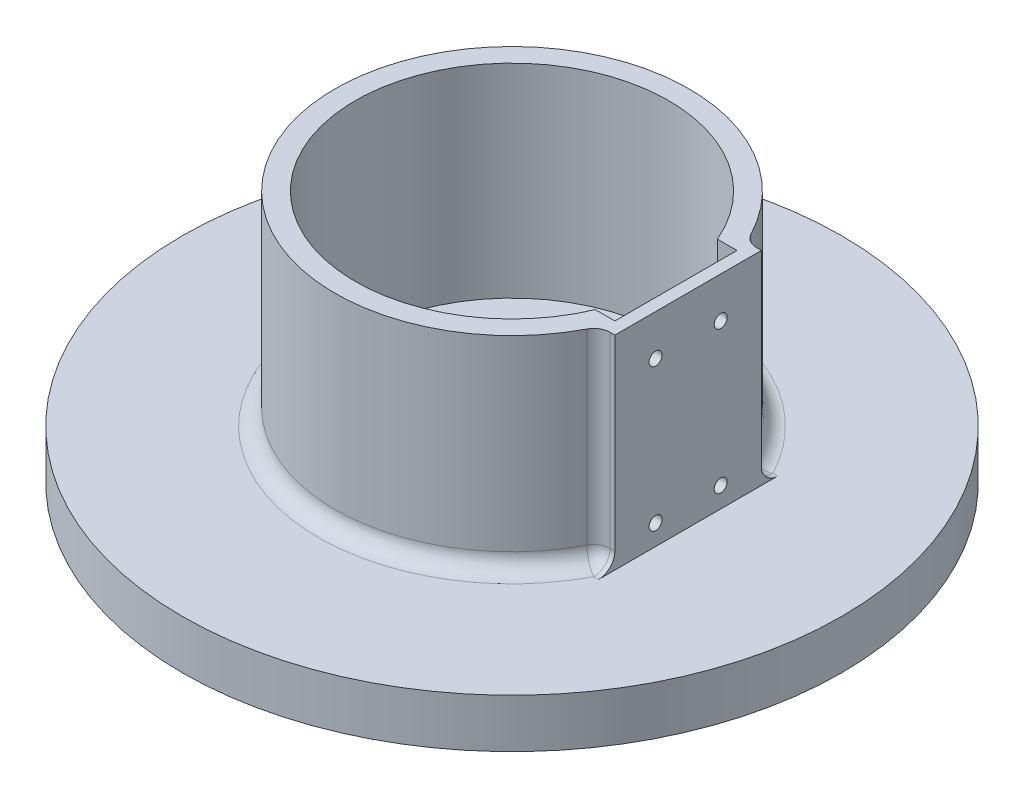
ISO-10303-21;
HEADER;
FILE_DESCRIPTION(('STEP AP214'),'2;1');
FILE_NAME('part.step','',(''),(''),'','','');
FILE_SCHEMA(('AUTOMOTIVE_DESIGN { 1 0 10303 214 1 1 1 1 }'));
ENDSEC;
DATA;
#1=APPLICATION_CONTEXT('core data for automotive mechanical design processes');
#2=APPLICATION_PROTOCOL_DEFINITION('international standard','automotive_design',2000,#1);
#3=PRODUCT_CONTEXT('',#1,'mechanical');
#4=PRODUCT('Part','Part','',(#3));
#5=PRODUCT_RELATED_PRODUCT_CATEGORY('part','',(#4));
#6=PRODUCT_DEFINITION_FORMATION('','',#4);
#7=PRODUCT_DEFINITION_CONTEXT('part definition',#1,'design');
#8=PRODUCT_DEFINITION('design','',#6,#7);
#9=PRODUCT_DEFINITION_SHAPE('','',#8);
#10=(LENGTH_UNIT() NAMED_UNIT(*) SI_UNIT(.MILLI.,.METRE.));
#11=(NAMED_UNIT(*) PLANE_ANGLE_UNIT() SI_UNIT($,.RADIAN.));
#12=(NAMED_UNIT(*) SI_UNIT($,.STERADIAN.) SOLID_ANGLE_UNIT());
#13=UNCERTAINTY_MEASURE_WITH_UNIT(LENGTH_MEASURE(1.E-05),#10,'distance_accuracy_value','');
#14=(GEOMETRIC_REPRESENTATION_CONTEXT(3) GLOBAL_UNCERTAINTY_ASSIGNED_CONTEXT((#13)) GLOBAL_UNIT_ASSIGNED_CONTEXT((#10,
#11,#12)) REPRESENTATION_CONTEXT('',''));
#15=CARTESIAN_POINT('',(0.,0.,0.));
#16=DIRECTION('',(0.,0.,1.));
#17=DIRECTION('',(1.,0.,0.));
#18=AXIS2_PLACEMENT_3D('',#15,#16,#17);
#19=CARTESIAN_POINT('',(105.5,12.,-60.5));
#20=DIRECTION('',(0.,1.,0.));
#21=DIRECTION('',(0.,0.,1.));
#22=AXIS2_PLACEMENT_3D('',#19,#20,#21);
#23=PLANE('',#22);
#24=CARTESIAN_POINT('',(105.5,12.,-60.5));
#25=DIRECTION('',(0.,1.,0.));
#26=DIRECTION('',(0.,0.,1.));
#27=AXIS2_PLACEMENT_3D('',#24,#25,#26);
#28=CIRCLE('',#27,81.);
#29=CARTESIAN_POINT('',(105.5,12.,20.5));
#30=VERTEX_POINT('',#29);
#31=EDGE_CURVE('E224',#30,#30,#28,.T.);
#32=ORIENTED_EDGE('',*,*,#31,.T.);
#33=EDGE_LOOP('',(#32));
#34=FACE_BOUND('',#33,.T.);
#35=DIRECTION('',(1.,0.,0.));
#36=VECTOR('',#35,1.);
#37=CARTESIAN_POINT('',(148.77536626395,12.,-82.5));
#38=LINE('',#37,#36);
#39=CARTESIAN_POINT('',(147.598099719584,12.,-82.5));
#40=VERTEX_POINT('',#39);
#41=CARTESIAN_POINT('',(148.77536626395,12.,-82.5));
#42=VERTEX_POINT('',#41);
#43=EDGE_CURVE('E240',#40,#42,#38,.T.);
#44=ORIENTED_EDGE('',*,*,#43,.T.);
#45=DIRECTION('',(0.,0.,1.));
#46=VECTOR('',#45,1.);
#47=CARTESIAN_POINT('',(148.77536626395,12.,0.));
#48=LINE('',#47,#46);
#49=CARTESIAN_POINT('',(148.77536626395,12.,-38.5));
#50=VERTEX_POINT('',#49);
#51=EDGE_CURVE('E181',#42,#50,#48,.T.);
#52=ORIENTED_EDGE('',*,*,#51,.T.);
#53=DIRECTION('',(1.,0.,0.));
#54=VECTOR('',#53,1.);
#55=CARTESIAN_POINT('',(105.5,12.,-38.5));
#56=LINE('',#55,#54);
#57=CARTESIAN_POINT('',(147.598099719584,12.,-38.5));
#58=VERTEX_POINT('',#57);
#59=EDGE_CURVE('E237',#50,#58,#56,.F.);
#60=ORIENTED_EDGE('',*,*,#59,.T.);
#61=CARTESIAN_POINT('',(105.5,12.,-60.5));
#62=DIRECTION('',(0.,1.,0.));
#63=DIRECTION('',(0.,0.,1.));
#64=AXIS2_PLACEMENT_3D('',#61,#62,#63);
#65=CIRCLE('',#64,47.5);
#66=EDGE_CURVE('E228',#58,#40,#65,.F.);
#67=ORIENTED_EDGE('',*,*,#66,.T.);
#68=EDGE_LOOP('',(#44,#52,#60,#67));
#69=FACE_BOUND('',#68,.T.);
#70=ADVANCED_FACE('F44',(#34,#69),#23,.T.);
#71=CARTESIAN_POINT('',(105.5,12.,-60.5));
#72=DIRECTION('',(0.,1.,0.));
#73=DIRECTION('',(0.,0.,1.));
#74=AXIS2_PLACEMENT_3D('',#71,#72,#73);
#75=CIRCLE('',#74,32.);
#76=CARTESIAN_POINT('',(105.5,12.,-28.5));
#77=VERTEX_POINT('',#76);
#78=EDGE_CURVE('E212',#77,#77,#75,.T.);
#79=ORIENTED_EDGE('',*,*,#78,.F.);
#80=EDGE_LOOP('',(#79));
#81=FACE_BOUND('',#80,.T.);
#82=DIRECTION('',(1.,0.,0.));
#83=VECTOR('',#82,1.);
#84=CARTESIAN_POINT('',(0.,12.,-45.5));
#85=LINE('',#84,#83);
#86=CARTESIAN_POINT('',(140.957721302983,12.,-45.5));
#87=VERTEX_POINT('',#86);
#88=CARTESIAN_POINT('',(145.77536626395,12.,-45.5));
#89=VERTEX_POINT('',#88);
#90=EDGE_CURVE('E189',#87,#89,#85,.T.);
#91=ORIENTED_EDGE('',*,*,#90,.T.);
#92=DIRECTION('',(0.,0.,1.));
#93=VECTOR('',#92,1.);
#94=CARTESIAN_POINT('',(145.77536626395,12.,0.));
#95=LINE('',#94,#93);
#96=CARTESIAN_POINT('',(145.77536626395,12.,-75.5));
#97=VERTEX_POINT('',#96);
#98=EDGE_CURVE('E184',#97,#89,#95,.T.);
#99=ORIENTED_EDGE('',*,*,#98,.F.);
#100=DIRECTION('',(1.,0.,0.));
#101=VECTOR('',#100,1.);
#102=CARTESIAN_POINT('',(0.,12.,-75.5));
#103=LINE('',#102,#101);
#104=CARTESIAN_POINT('',(140.957721302983,12.,-75.5));
#105=VERTEX_POINT('',#104);
#106=EDGE_CURVE('E141',#105,#97,#103,.T.);
#107=ORIENTED_EDGE('',*,*,#106,.F.);
#108=CARTESIAN_POINT('',(105.5,12.,-60.5));
#109=DIRECTION('',(0.,1.,0.));
#110=DIRECTION('',(0.,0.,1.));
#111=AXIS2_PLACEMENT_3D('',#108,#109,#110);
#112=CIRCLE('',#111,38.5);
#113=EDGE_CURVE('E193',#105,#87,#112,.T.);
#114=ORIENTED_EDGE('',*,*,#113,.T.);
#115=EDGE_LOOP('',(#91,#99,#107,#114));
#116=FACE_BOUND('',#115,.T.);
#117=ADVANCED_FACE('F316',(#81,#116),#23,.T.);
#118=CARTESIAN_POINT('',(105.5,12.,-60.5));
#119=DIRECTION('',(0.,-1.,0.));
#120=DIRECTION('',(0.,0.,-1.));
#121=AXIS2_PLACEMENT_3D('',#118,#119,#120);
#122=CYLINDRICAL_SURFACE('',#121,81.);
#123=ORIENTED_EDGE('',*,*,#31,.F.);
#124=EDGE_LOOP('',(#123));
#125=FACE_BOUND('',#124,.T.);
#126=CARTESIAN_POINT('',(105.5,0.,-60.5));
#127=DIRECTION('',(0.,1.,0.));
#128=DIRECTION('',(0.,0.,1.));
#129=AXIS2_PLACEMENT_3D('',#126,#127,#128);
#130=CIRCLE('',#129,81.);
#131=CARTESIAN_POINT('',(105.5,0.,20.5));
#132=VERTEX_POINT('',#131);
#133=EDGE_CURVE('E223',#132,#132,#130,.T.);
#134=ORIENTED_EDGE('',*,*,#133,.T.);
#135=EDGE_LOOP('',(#134));
#136=FACE_BOUND('',#135,.T.);
#137=ADVANCED_FACE('F322',(#125,#136),#122,.T.);
#138=CARTESIAN_POINT('',(105.5,0.,-60.5));
#139=DIRECTION('',(0.,1.,0.));
#140=DIRECTION('',(0.,0.,1.));
#141=AXIS2_PLACEMENT_3D('',#138,#139,#140);
#142=PLANE('',#141);
#143=CARTESIAN_POINT('',(105.5,0.,-60.5));
#144=DIRECTION('',(0.,-1.,0.));
#145=DIRECTION('',(0.,0.,-1.));
#146=AXIS2_PLACEMENT_3D('',#143,#144,#145);
#147=CIRCLE('',#146,76.);
#148=CARTESIAN_POINT('',(105.5,0.,-136.5));
#149=VERTEX_POINT('',#148);
#150=EDGE_CURVE('E219',#149,#149,#147,.T.);
#151=ORIENTED_EDGE('',*,*,#150,.F.);
#152=EDGE_LOOP('',(#151));
#153=FACE_BOUND('',#152,.T.);
#154=ORIENTED_EDGE('',*,*,#133,.F.);
#155=EDGE_LOOP('',(#154));
#156=FACE_BOUND('',#155,.T.);
#157=ADVANCED_FACE('F329',(#153,#156),#142,.F.);
#158=CARTESIAN_POINT('',(105.5,7.,-60.5));
#159=DIRECTION('',(0.,-1.,0.));
#160=DIRECTION('',(0.,0.,-1.));
#161=AXIS2_PLACEMENT_3D('',#158,#159,#160);
#162=CYLINDRICAL_SURFACE('',#161,76.);
#163=CARTESIAN_POINT('',(105.5,5.,-60.5));
#164=DIRECTION('',(0.,-1.,0.));
#165=DIRECTION('',(0.,0.,-1.));
#166=AXIS2_PLACEMENT_3D('',#163,#164,#165);
#167=CIRCLE('',#166,76.);
#168=CARTESIAN_POINT('',(105.5,5.,-136.5));
#169=VERTEX_POINT('',#168);
#170=EDGE_CURVE('E11',#169,#169,#167,.F.);
#171=ORIENTED_EDGE('',*,*,#170,.T.);
#172=EDGE_LOOP('',(#171));
#173=FACE_BOUND('',#172,.T.);
#174=ORIENTED_EDGE('',*,*,#150,.T.);
#175=EDGE_LOOP('',(#174));
#176=FACE_BOUND('',#175,.T.);
#177=ADVANCED_FACE('F327',(#173,#176),#162,.F.);
#178=CARTESIAN_POINT('',(105.5,7.,-60.5));
#179=DIRECTION('',(0.,-1.,0.));
#180=DIRECTION('',(0.,0.,-1.));
#181=AXIS2_PLACEMENT_3D('',#178,#179,#180);
#182=PLANE('',#181);
#183=CARTESIAN_POINT('',(105.5,7.,-60.5));
#184=DIRECTION('',(0.,-1.,0.));
#185=DIRECTION('',(0.,0.,-1.));
#186=AXIS2_PLACEMENT_3D('',#183,#184,#185);
#187=CIRCLE('',#186,74.);
#188=CARTESIAN_POINT('',(105.5,7.,-134.5));
#189=VERTEX_POINT('',#188);
#190=EDGE_CURVE('E53',#189,#189,#187,.T.);
#191=ORIENTED_EDGE('',*,*,#190,.T.);
#192=EDGE_LOOP('',(#191));
#193=FACE_BOUND('',#192,.T.);
#194=CARTESIAN_POINT('',(105.5,7.,-60.5));
#195=DIRECTION('',(0.,-1.,0.));
#196=DIRECTION('',(0.,0.,-1.));
#197=AXIS2_PLACEMENT_3D('',#194,#195,#196);
#198=CIRCLE('',#197,32.);
#199=CARTESIAN_POINT('',(105.5,7.,-92.5));
#200=VERTEX_POINT('',#199);
#201=EDGE_CURVE('E218',#200,#200,#198,.T.);
#202=ORIENTED_EDGE('',*,*,#201,.F.);
#203=EDGE_LOOP('',(#202));
#204=FACE_BOUND('',#203,.T.);
#205=ADVANCED_FACE('F302',(#193,#204),#182,.T.);
#206=CARTESIAN_POINT('',(105.5,0.,-60.5));
#207=DIRECTION('',(0.,1.,0.));
#208=DIRECTION('',(0.,0.,1.));
#209=AXIS2_PLACEMENT_3D('',#206,#207,#208);
#210=CYLINDRICAL_SURFACE('',#209,32.);
#211=ORIENTED_EDGE('',*,*,#201,.T.);
#212=EDGE_LOOP('',(#211));
#213=FACE_BOUND('',#212,.T.);
#214=ORIENTED_EDGE('',*,*,#78,.T.);
#215=EDGE_LOOP('',(#214));
#216=FACE_BOUND('',#215,.T.);
#217=ADVANCED_FACE('F405',(#213,#216),#210,.F.);
#218=CARTESIAN_POINT('',(145.77536626395,62.,0.));
#219=DIRECTION('',(1.,0.,0.));
#220=DIRECTION('',(0.,0.,-1.));
#221=AXIS2_PLACEMENT_3D('',#218,#219,#220);
#222=PLANE('',#221);
#223=CARTESIAN_POINT('',(145.77536626395,17.,-52.5));
#224=DIRECTION('',(1.,0.,0.));
#225=DIRECTION('',(0.,0.,-1.));
#226=AXIS2_PLACEMENT_3D('',#223,#224,#225);
#227=CIRCLE('',#226,1.6);
#228=CARTESIAN_POINT('',(145.77536626395,17.,-54.1));
#229=VERTEX_POINT('',#228);
#230=EDGE_CURVE('E185',#229,#229,#227,.T.);
#231=ORIENTED_EDGE('',*,*,#230,.T.);
#232=EDGE_LOOP('',(#231));
#233=FACE_BOUND('',#232,.T.);
#234=CARTESIAN_POINT('',(145.77536626395,17.,-68.5));
#235=DIRECTION('',(1.,0.,0.));
#236=DIRECTION('',(0.,0.,-1.));
#237=AXIS2_PLACEMENT_3D('',#234,#235,#236);
#238=CIRCLE('',#237,1.6);
#239=CARTESIAN_POINT('',(145.77536626395,17.,-70.1));
#240=VERTEX_POINT('',#239);
#241=EDGE_CURVE('E703',#240,#240,#238,.T.);
#242=ORIENTED_EDGE('',*,*,#241,.T.);
#243=EDGE_LOOP('',(#242));
#244=FACE_BOUND('',#243,.T.);
#245=CARTESIAN_POINT('',(145.77536626395,52.,-68.5));
#246=DIRECTION('',(1.,0.,0.));
#247=DIRECTION('',(0.,0.,-1.));
#248=AXIS2_PLACEMENT_3D('',#245,#246,#247);
#249=CIRCLE('',#248,1.60000000000001);
#250=CARTESIAN_POINT('',(145.77536626395,52.,-70.1));
#251=VERTEX_POINT('',#250);
#252=EDGE_CURVE('E707',#251,#251,#249,.T.);
#253=ORIENTED_EDGE('',*,*,#252,.T.);
#254=EDGE_LOOP('',(#253));
#255=FACE_BOUND('',#254,.T.);
#256=CARTESIAN_POINT('',(145.77536626395,52.,-52.5));
#257=DIRECTION('',(1.,0.,0.));
#258=DIRECTION('',(0.,0.,-1.));
#259=AXIS2_PLACEMENT_3D('',#256,#257,#258);
#260=CIRCLE('',#259,1.60000000000001);
#261=CARTESIAN_POINT('',(145.77536626395,52.,-54.1));
#262=VERTEX_POINT('',#261);
#263=EDGE_CURVE('E710',#262,#262,#260,.T.);
#264=ORIENTED_EDGE('',*,*,#263,.T.);
#265=EDGE_LOOP('',(#264));
#266=FACE_BOUND('',#265,.T.);
#267=ORIENTED_EDGE('',*,*,#98,.T.);
#268=DIRECTION('',(0.,-1.,0.));
#269=VECTOR('',#268,1.);
#270=CARTESIAN_POINT('',(145.77536626395,62.,-45.5));
#271=LINE('',#270,#269);
#272=CARTESIAN_POINT('',(145.77536626395,62.,-45.5));
#273=VERTEX_POINT('',#272);
#274=EDGE_CURVE('E209',#273,#89,#271,.T.);
#275=ORIENTED_EDGE('',*,*,#274,.F.);
#276=DIRECTION('',(0.,0.,1.));
#277=VECTOR('',#276,1.);
#278=CARTESIAN_POINT('',(145.77536626395,62.,0.));
#279=LINE('',#278,#277);
#280=CARTESIAN_POINT('',(145.77536626395,62.,-75.5));
#281=VERTEX_POINT('',#280);
#282=EDGE_CURVE('E167',#281,#273,#279,.T.);
#283=ORIENTED_EDGE('',*,*,#282,.F.);
#284=DIRECTION('',(0.,-1.,0.));
#285=VECTOR('',#284,1.);
#286=CARTESIAN_POINT('',(145.77536626395,62.,-75.5));
#287=LINE('',#286,#285);
#288=EDGE_CURVE('E151',#281,#97,#287,.T.);
#289=ORIENTED_EDGE('',*,*,#288,.T.);
#290=EDGE_LOOP('',(#267,#275,#283,#289));
#291=FACE_BOUND('',#290,.T.);
#292=ADVANCED_FACE('F396',(#233,#244,#255,#266,#291),#222,.F.);
#293=CARTESIAN_POINT('',(0.,62.,-45.5));
#294=DIRECTION('',(0.,0.,-1.));
#295=DIRECTION('',(-1.,0.,0.));
#296=AXIS2_PLACEMENT_3D('',#293,#294,#295);
#297=PLANE('',#296);
#298=ORIENTED_EDGE('',*,*,#90,.F.);
#299=DIRECTION('',(0.,-1.,0.));
#300=VECTOR('',#299,1.);
#301=CARTESIAN_POINT('',(140.957721302983,62.,-45.5));
#302=LINE('',#301,#300);
#303=CARTESIAN_POINT('',(140.957721302983,62.,-45.5));
#304=VERTEX_POINT('',#303);
#305=EDGE_CURVE('E206',#304,#87,#302,.T.);
#306=ORIENTED_EDGE('',*,*,#305,.F.);
#307=DIRECTION('',(1.,0.,0.));
#308=VECTOR('',#307,1.);
#309=CARTESIAN_POINT('',(0.,62.,-45.5));
#310=LINE('',#309,#308);
#311=EDGE_CURVE('E170',#304,#273,#310,.T.);
#312=ORIENTED_EDGE('',*,*,#311,.T.);
#313=ORIENTED_EDGE('',*,*,#274,.T.);
#314=EDGE_LOOP('',(#298,#306,#312,#313));
#315=FACE_BOUND('',#314,.T.);
#316=ADVANCED_FACE('F558',(#315),#297,.T.);
#317=CARTESIAN_POINT('',(105.5,62.,-60.5));
#318=DIRECTION('',(0.,-1.,0.));
#319=DIRECTION('',(0.,0.,-1.));
#320=AXIS2_PLACEMENT_3D('',#317,#318,#319);
#321=CYLINDRICAL_SURFACE('',#320,38.5);
#322=ORIENTED_EDGE('',*,*,#113,.F.);
#323=DIRECTION('',(0.,-1.,0.));
#324=VECTOR('',#323,1.);
#325=CARTESIAN_POINT('',(140.957721302983,62.,-75.5));
#326=LINE('',#325,#324);
#327=CARTESIAN_POINT('',(140.957721302983,62.,-75.5));
#328=VERTEX_POINT('',#327);
#329=EDGE_CURVE('E202',#328,#105,#326,.T.);
#330=ORIENTED_EDGE('',*,*,#329,.F.);
#331=CARTESIAN_POINT('',(105.5,62.,-60.5));
#332=DIRECTION('',(0.,1.,0.));
#333=DIRECTION('',(0.,0.,1.));
#334=AXIS2_PLACEMENT_3D('',#331,#332,#333);
#335=CIRCLE('',#334,38.5);
#336=EDGE_CURVE('E174',#328,#304,#335,.T.);
#337=ORIENTED_EDGE('',*,*,#336,.T.);
#338=ORIENTED_EDGE('',*,*,#305,.T.);
#339=EDGE_LOOP('',(#322,#330,#337,#338));
#340=FACE_BOUND('',#339,.T.);
#341=ADVANCED_FACE('F404',(#340),#321,.F.);
#342=CARTESIAN_POINT('',(0.,62.,-42.5000000000001));
#343=DIRECTION('',(0.,0.,-1.));
#344=DIRECTION('',(-1.,0.,0.));
#345=AXIS2_PLACEMENT_3D('',#342,#343,#344);
#346=PLANE('',#345);
#347=DIRECTION('',(1.,0.,0.));
#348=VECTOR('',#347,1.);
#349=CARTESIAN_POINT('',(0.,62.,-42.5000000000001));
#350=LINE('',#349,#348);
#351=CARTESIAN_POINT('',(147.598099719584,62.,-42.5));
#352=VERTEX_POINT('',#351);
#353=CARTESIAN_POINT('',(148.77536626395,62.,-42.5));
#354=VERTEX_POINT('',#353);
#355=EDGE_CURVE('E133',#352,#354,#350,.T.);
#356=ORIENTED_EDGE('',*,*,#355,.F.);
#357=DIRECTION('',(0.,1.,0.));
#358=VECTOR('',#357,1.);
#359=CARTESIAN_POINT('',(147.598099719584,12.,-42.5));
#360=LINE('',#359,#358);
#361=CARTESIAN_POINT('',(147.598099719584,16.,-42.5));
#362=VERTEX_POINT('',#361);
#363=EDGE_CURVE('E60',#352,#362,#360,.F.);
#364=ORIENTED_EDGE('',*,*,#363,.T.);
#365=DIRECTION('',(1.,0.,0.));
#366=VECTOR('',#365,1.);
#367=CARTESIAN_POINT('',(0.,16.,-42.5000000000001));
#368=LINE('',#367,#366);
#369=CARTESIAN_POINT('',(148.77536626395,16.,-42.5));
#370=VERTEX_POINT('',#369);
#371=EDGE_CURVE('E146',#362,#370,#368,.T.);
#372=ORIENTED_EDGE('',*,*,#371,.T.);
#373=DIRECTION('',(0.,-1.,0.));
#374=VECTOR('',#373,1.);
#375=CARTESIAN_POINT('',(148.77536626395,62.,-42.5));
#376=LINE('',#375,#374);
#377=EDGE_CURVE('E144',#354,#370,#376,.T.);
#378=ORIENTED_EDGE('',*,*,#377,.F.);
#379=EDGE_LOOP('',(#356,#364,#372,#378));
#380=FACE_BOUND('',#379,.T.);
#381=ADVANCED_FACE('F145',(#380),#346,.F.);
#382=CARTESIAN_POINT('',(148.77536626395,62.,0.));
#383=DIRECTION('',(1.,0.,0.));
#384=DIRECTION('',(0.,0.,-1.));
#385=AXIS2_PLACEMENT_3D('',#382,#383,#384);
#386=PLANE('',#385);
#387=CARTESIAN_POINT('',(148.77536626395,17.,-52.5));
#388=DIRECTION('',(1.,0.,0.));
#389=DIRECTION('',(0.,0.,-1.));
#390=AXIS2_PLACEMENT_3D('',#387,#388,#389);
#391=CIRCLE('',#390,1.6);
#392=CARTESIAN_POINT('',(148.77536626395,17.,-54.1));
#393=VERTEX_POINT('',#392);
#394=EDGE_CURVE('E297',#393,#393,#391,.T.);
#395=ORIENTED_EDGE('',*,*,#394,.F.);
#396=EDGE_LOOP('',(#395));
#397=FACE_BOUND('',#396,.T.);
#398=CARTESIAN_POINT('',(148.77536626395,17.,-68.5));
#399=DIRECTION('',(1.,0.,0.));
#400=DIRECTION('',(0.,0.,-1.));
#401=AXIS2_PLACEMENT_3D('',#398,#399,#400);
#402=CIRCLE('',#401,1.6);
#403=CARTESIAN_POINT('',(148.77536626395,17.,-70.1));
#404=VERTEX_POINT('',#403);
#405=EDGE_CURVE('E728',#404,#404,#402,.T.);
#406=ORIENTED_EDGE('',*,*,#405,.F.);
#407=EDGE_LOOP('',(#406));
#408=FACE_BOUND('',#407,.T.);
#409=CARTESIAN_POINT('',(148.77536626395,52.,-68.5));
#410=DIRECTION('',(1.,0.,0.));
#411=DIRECTION('',(0.,0.,-1.));
#412=AXIS2_PLACEMENT_3D('',#409,#410,#411);
#413=CIRCLE('',#412,1.60000000000001);
#414=CARTESIAN_POINT('',(148.77536626395,52.,-70.1));
#415=VERTEX_POINT('',#414);
#416=EDGE_CURVE('E719',#415,#415,#413,.T.);
#417=ORIENTED_EDGE('',*,*,#416,.F.);
#418=EDGE_LOOP('',(#417));
#419=FACE_BOUND('',#418,.T.);
#420=CARTESIAN_POINT('',(148.77536626395,52.,-52.5));
#421=DIRECTION('',(1.,0.,0.));
#422=DIRECTION('',(0.,0.,-1.));
#423=AXIS2_PLACEMENT_3D('',#420,#421,#422);
#424=CIRCLE('',#423,1.60000000000001);
#425=CARTESIAN_POINT('',(148.77536626395,52.,-54.1));
#426=VERTEX_POINT('',#425);
#427=EDGE_CURVE('E713',#426,#426,#424,.T.);
#428=ORIENTED_EDGE('',*,*,#427,.F.);
#429=EDGE_LOOP('',(#428));
#430=FACE_BOUND('',#429,.T.);
#431=ORIENTED_EDGE('',*,*,#51,.F.);
#432=CARTESIAN_POINT('',(148.77536626395,16.,-82.5));
#433=DIRECTION('',(1.,0.,0.));
#434=DIRECTION('',(0.,0.,-1.));
#435=AXIS2_PLACEMENT_3D('',#432,#433,#434);
#436=CIRCLE('',#435,4.);
#437=CARTESIAN_POINT('',(148.77536626395,16.,-78.5));
#438=VERTEX_POINT('',#437);
#439=EDGE_CURVE('E263',#42,#438,#436,.F.);
#440=ORIENTED_EDGE('',*,*,#439,.T.);
#441=DIRECTION('',(0.,-1.,0.));
#442=VECTOR('',#441,1.);
#443=CARTESIAN_POINT('',(148.77536626395,62.,-78.5));
#444=LINE('',#443,#442);
#445=CARTESIAN_POINT('',(148.77536626395,62.,-78.5));
#446=VERTEX_POINT('',#445);
#447=EDGE_CURVE('E152',#446,#438,#444,.T.);
#448=ORIENTED_EDGE('',*,*,#447,.F.);
#449=DIRECTION('',(0.,0.,1.));
#450=VECTOR('',#449,1.);
#451=CARTESIAN_POINT('',(148.77536626395,62.,0.));
#452=LINE('',#451,#450);
#453=EDGE_CURVE('E139',#446,#354,#452,.T.);
#454=ORIENTED_EDGE('',*,*,#453,.T.);
#455=ORIENTED_EDGE('',*,*,#377,.T.);
#456=CARTESIAN_POINT('',(148.77536626395,16.,-38.5));
#457=DIRECTION('',(1.,0.,0.));
#458=DIRECTION('',(0.,0.,-1.));
#459=AXIS2_PLACEMENT_3D('',#456,#457,#458);
#460=CIRCLE('',#459,4.);
#461=EDGE_CURVE('E271',#370,#50,#460,.F.);
#462=ORIENTED_EDGE('',*,*,#461,.T.);
#463=EDGE_LOOP('',(#431,#440,#448,#454,#455,#462));
#464=FACE_BOUND('',#463,.T.);
#465=ADVANCED_FACE('F155',(#397,#408,#419,#430,#464),#386,.T.);
#466=CARTESIAN_POINT('',(0.,62.,-78.4999999999999));
#467=DIRECTION('',(0.,0.,-1.));
#468=DIRECTION('',(-1.,0.,0.));
#469=AXIS2_PLACEMENT_3D('',#466,#467,#468);
#470=PLANE('',#469);
#471=ORIENTED_EDGE('',*,*,#447,.T.);
#472=DIRECTION('',(1.,0.,0.));
#473=VECTOR('',#472,1.);
#474=CARTESIAN_POINT('',(145.101136347332,16.,-78.5));
#475=LINE('',#474,#473);
#476=CARTESIAN_POINT('',(147.598099719584,16.,-78.5));
#477=VERTEX_POINT('',#476);
#478=EDGE_CURVE('E247',#438,#477,#475,.F.);
#479=ORIENTED_EDGE('',*,*,#478,.T.);
#480=DIRECTION('',(0.,-1.,0.));
#481=VECTOR('',#480,1.);
#482=CARTESIAN_POINT('',(147.598099719584,62.,-78.5));
#483=LINE('',#482,#481);
#484=CARTESIAN_POINT('',(147.598099719584,62.,-78.5));
#485=VERTEX_POINT('',#484);
#486=EDGE_CURVE('E244',#477,#485,#483,.F.);
#487=ORIENTED_EDGE('',*,*,#486,.T.);
#488=DIRECTION('',(1.,0.,0.));
#489=VECTOR('',#488,1.);
#490=CARTESIAN_POINT('',(0.,62.,-78.4999999999999));
#491=LINE('',#490,#489);
#492=EDGE_CURVE('E158',#485,#446,#491,.T.);
#493=ORIENTED_EDGE('',*,*,#492,.T.);
#494=EDGE_LOOP('',(#471,#479,#487,#493));
#495=FACE_BOUND('',#494,.T.);
#496=ADVANCED_FACE('F381',(#495),#470,.T.);
#497=CARTESIAN_POINT('',(105.5,62.,-60.5));
#498=DIRECTION('',(0.,-1.,0.));
#499=DIRECTION('',(0.,0.,-1.));
#500=AXIS2_PLACEMENT_3D('',#497,#498,#499);
#501=CYLINDRICAL_SURFACE('',#500,43.5);
#502=CARTESIAN_POINT('',(105.5,62.,-60.5));
#503=DIRECTION('',(0.,1.,0.));
#504=DIRECTION('',(0.,0.,1.));
#505=AXIS2_PLACEMENT_3D('',#502,#503,#504);
#506=CIRCLE('',#505,43.5);
#507=CARTESIAN_POINT('',(144.052996585303,62.,-80.6473684210526));
#508=VERTEX_POINT('',#507);
#509=CARTESIAN_POINT('',(144.052996585303,62.,-40.3526315789473));
#510=VERTEX_POINT('',#509);
#511=EDGE_CURVE('E161',#508,#510,#506,.T.);
#512=ORIENTED_EDGE('',*,*,#511,.F.);
#513=DIRECTION('',(0.,-1.,0.));
#514=VECTOR('',#513,1.);
#515=CARTESIAN_POINT('',(144.052996585303,62.,-80.6473684210526));
#516=LINE('',#515,#514);
#517=CARTESIAN_POINT('',(144.052996585303,16.,-80.6473684210526));
#518=VERTEX_POINT('',#517);
#519=EDGE_CURVE('E256',#508,#518,#516,.T.);
#520=ORIENTED_EDGE('',*,*,#519,.T.);
#521=CARTESIAN_POINT('',(105.5,16.,-60.5));
#522=DIRECTION('',(0.,1.,0.));
#523=DIRECTION('',(0.,0.,1.));
#524=AXIS2_PLACEMENT_3D('',#521,#522,#523);
#525=CIRCLE('',#524,43.5);
#526=CARTESIAN_POINT('',(144.052996585303,16.,-40.3526315789473));
#527=VERTEX_POINT('',#526);
#528=EDGE_CURVE('E250',#518,#527,#525,.T.);
#529=ORIENTED_EDGE('',*,*,#528,.T.);
#530=DIRECTION('',(0.,-1.,0.));
#531=VECTOR('',#530,1.);
#532=CARTESIAN_POINT('',(144.052996585303,62.,-40.3526315789473));
#533=LINE('',#532,#531);
#534=EDGE_CURVE('E253',#527,#510,#533,.F.);
#535=ORIENTED_EDGE('',*,*,#534,.T.);
#536=EDGE_LOOP('',(#512,#520,#529,#535));
#537=FACE_BOUND('',#536,.T.);
#538=ADVANCED_FACE('F384',(#537),#501,.T.);
#539=CARTESIAN_POINT('',(0.,62.,-75.5));
#540=DIRECTION('',(0.,0.,-1.));
#541=DIRECTION('',(-1.,0.,0.));
#542=AXIS2_PLACEMENT_3D('',#539,#540,#541);
#543=PLANE('',#542);
#544=ORIENTED_EDGE('',*,*,#106,.T.);
#545=ORIENTED_EDGE('',*,*,#288,.F.);
#546=DIRECTION('',(1.,0.,0.));
#547=VECTOR('',#546,1.);
#548=CARTESIAN_POINT('',(0.,62.,-75.5));
#549=LINE('',#548,#547);
#550=EDGE_CURVE('E178',#328,#281,#549,.T.);
#551=ORIENTED_EDGE('',*,*,#550,.F.);
#552=ORIENTED_EDGE('',*,*,#329,.T.);
#553=EDGE_LOOP('',(#544,#545,#551,#552));
#554=FACE_BOUND('',#553,.T.);
#555=ADVANCED_FACE('F386',(#554),#543,.F.);
#556=CARTESIAN_POINT('',(0.,62.,0.));
#557=DIRECTION('',(0.,1.,0.));
#558=DIRECTION('',(0.,0.,1.));
#559=AXIS2_PLACEMENT_3D('',#556,#557,#558);
#560=PLANE('',#559);
#561=ORIENTED_EDGE('',*,*,#511,.T.);
#562=CARTESIAN_POINT('',(147.598099719584,62.,-38.5));
#563=DIRECTION('',(0.,1.,0.));
#564=DIRECTION('',(0.,0.,1.));
#565=AXIS2_PLACEMENT_3D('',#562,#563,#564);
#566=CIRCLE('',#565,4.);
#567=EDGE_CURVE('E68',#510,#352,#566,.F.);
#568=ORIENTED_EDGE('',*,*,#567,.T.);
#569=ORIENTED_EDGE('',*,*,#355,.T.);
#570=ORIENTED_EDGE('',*,*,#453,.F.);
#571=ORIENTED_EDGE('',*,*,#492,.F.);
#572=CARTESIAN_POINT('',(147.598099719584,62.,-82.5));
#573=DIRECTION('',(0.,1.,0.));
#574=DIRECTION('',(0.,0.,1.));
#575=AXIS2_PLACEMENT_3D('',#572,#573,#574);
#576=CIRCLE('',#575,4.);
#577=EDGE_CURVE('E266',#485,#508,#576,.F.);
#578=ORIENTED_EDGE('',*,*,#577,.T.);
#579=EDGE_LOOP('',(#561,#568,#569,#570,#571,#578));
#580=FACE_BOUND('',#579,.T.);
#581=ORIENTED_EDGE('',*,*,#282,.T.);
#582=ORIENTED_EDGE('',*,*,#311,.F.);
#583=ORIENTED_EDGE('',*,*,#336,.F.);
#584=ORIENTED_EDGE('',*,*,#550,.T.);
#585=EDGE_LOOP('',(#581,#582,#583,#584));
#586=FACE_BOUND('',#585,.T.);
#587=ADVANCED_FACE('F135',(#580,#586),#560,.T.);
#588=CARTESIAN_POINT('',(142.77536626395,52.,-52.5));
#589=DIRECTION('',(1.,0.,0.));
#590=DIRECTION('',(0.,0.,-1.));
#591=AXIS2_PLACEMENT_3D('',#588,#589,#590);
#592=CYLINDRICAL_SURFACE('',#591,1.60000000000001);
#593=ORIENTED_EDGE('',*,*,#427,.T.);
#594=EDGE_LOOP('',(#593));
#595=FACE_BOUND('',#594,.T.);
#596=ORIENTED_EDGE('',*,*,#263,.F.);
#597=EDGE_LOOP('',(#596));
#598=FACE_BOUND('',#597,.T.);
#599=ADVANCED_FACE('F475',(#595,#598),#592,.F.);
#600=CARTESIAN_POINT('',(142.77536626395,52.,-68.5));
#601=DIRECTION('',(1.,0.,0.));
#602=DIRECTION('',(0.,0.,-1.));
#603=AXIS2_PLACEMENT_3D('',#600,#601,#602);
#604=CYLINDRICAL_SURFACE('',#603,1.60000000000001);
#605=ORIENTED_EDGE('',*,*,#416,.T.);
#606=EDGE_LOOP('',(#605));
#607=FACE_BOUND('',#606,.T.);
#608=ORIENTED_EDGE('',*,*,#252,.F.);
#609=EDGE_LOOP('',(#608));
#610=FACE_BOUND('',#609,.T.);
#611=ADVANCED_FACE('F529',(#607,#610),#604,.F.);
#612=CARTESIAN_POINT('',(142.77536626395,17.,-68.5));
#613=DIRECTION('',(1.,0.,0.));
#614=DIRECTION('',(0.,0.,-1.));
#615=AXIS2_PLACEMENT_3D('',#612,#613,#614);
#616=CYLINDRICAL_SURFACE('',#615,1.6);
#617=ORIENTED_EDGE('',*,*,#405,.T.);
#618=EDGE_LOOP('',(#617));
#619=FACE_BOUND('',#618,.T.);
#620=ORIENTED_EDGE('',*,*,#241,.F.);
#621=EDGE_LOOP('',(#620));
#622=FACE_BOUND('',#621,.T.);
#623=ADVANCED_FACE('F361',(#619,#622),#616,.F.);
#624=CARTESIAN_POINT('',(142.77536626395,17.,-52.5));
#625=DIRECTION('',(1.,0.,0.));
#626=DIRECTION('',(0.,0.,-1.));
#627=AXIS2_PLACEMENT_3D('',#624,#625,#626);
#628=CYLINDRICAL_SURFACE('',#627,1.6);
#629=ORIENTED_EDGE('',*,*,#394,.T.);
#630=EDGE_LOOP('',(#629));
#631=FACE_BOUND('',#630,.T.);
#632=ORIENTED_EDGE('',*,*,#230,.F.);
#633=EDGE_LOOP('',(#632));
#634=FACE_BOUND('',#633,.T.);
#635=ADVANCED_FACE('F356',(#631,#634),#628,.F.);
#636=CARTESIAN_POINT('',(147.598099719584,62.,-38.5));
#637=DIRECTION('',(0.,-1.,0.));
#638=DIRECTION('',(0.,0.,-1.));
#639=AXIS2_PLACEMENT_3D('',#636,#637,#638);
#640=CYLINDRICAL_SURFACE('',#639,4.);
#641=ORIENTED_EDGE('',*,*,#567,.F.);
#642=ORIENTED_EDGE('',*,*,#534,.F.);
#643=CARTESIAN_POINT('',(147.598099719584,16.,-38.5));
#644=DIRECTION('',(0.,1.,0.));
#645=DIRECTION('',(0.,0.,1.));
#646=AXIS2_PLACEMENT_3D('',#643,#644,#645);
#647=CIRCLE('',#646,4.);
#648=EDGE_CURVE('E294',#362,#527,#647,.T.);
#649=ORIENTED_EDGE('',*,*,#648,.F.);
#650=ORIENTED_EDGE('',*,*,#363,.F.);
#651=EDGE_LOOP('',(#641,#642,#649,#650));
#652=FACE_BOUND('',#651,.T.);
#653=ADVANCED_FACE('F353',(#652),#640,.F.);
#654=CARTESIAN_POINT('',(0.,16.,-38.5000000000001));
#655=DIRECTION('',(1.,0.,0.));
#656=DIRECTION('',(0.,0.,-1.));
#657=AXIS2_PLACEMENT_3D('',#654,#655,#656);
#658=CYLINDRICAL_SURFACE('',#657,4.);
#659=ORIENTED_EDGE('',*,*,#461,.F.);
#660=ORIENTED_EDGE('',*,*,#371,.F.);
#661=CARTESIAN_POINT('',(147.598099719584,16.,-38.5));
#662=DIRECTION('',(1.,0.,0.));
#663=DIRECTION('',(0.,0.,-1.));
#664=AXIS2_PLACEMENT_3D('',#661,#662,#663);
#665=CIRCLE('',#664,4.);
#666=EDGE_CURVE('E290',#58,#362,#665,.T.);
#667=ORIENTED_EDGE('',*,*,#666,.F.);
#668=ORIENTED_EDGE('',*,*,#59,.F.);
#669=EDGE_LOOP('',(#659,#660,#667,#668));
#670=FACE_BOUND('',#669,.T.);
#671=ADVANCED_FACE('F350',(#670),#658,.F.);
#672=CARTESIAN_POINT('',(147.598099719584,16.,-38.5));
#673=DIRECTION('',(0.,-1.,0.));
#674=DIRECTION('',(0.,0.,-1.));
#675=AXIS2_PLACEMENT_3D('',#672,#673,#674);
#676=SPHERICAL_SURFACE('',#675,4.);
#677=ORIENTED_EDGE('',*,*,#666,.T.);
#678=ORIENTED_EDGE('',*,*,#648,.T.);
#679=CARTESIAN_POINT('',(147.598099719584,16.,-38.5));
#680=DIRECTION('',(-0.463157894736842,0.,0.88627578357018));
#681=DIRECTION('',(0.88627578357018,0.,0.463157894736842));
#682=AXIS2_PLACEMENT_3D('',#679,#680,#681);
#683=CIRCLE('',#682,4.);
#684=EDGE_CURVE('E286',#58,#527,#683,.F.);
#685=ORIENTED_EDGE('',*,*,#684,.F.);
#686=EDGE_LOOP('',(#677,#678,#685));
#687=FACE_BOUND('',#686,.T.);
#688=ADVANCED_FACE('F346',(#687),#676,.F.);
#689=CARTESIAN_POINT('',(147.598099719584,62.,-82.5));
#690=DIRECTION('',(0.,-1.,0.));
#691=DIRECTION('',(0.,0.,-1.));
#692=AXIS2_PLACEMENT_3D('',#689,#690,#691);
#693=CYLINDRICAL_SURFACE('',#692,4.);
#694=ORIENTED_EDGE('',*,*,#577,.F.);
#695=ORIENTED_EDGE('',*,*,#486,.F.);
#696=CARTESIAN_POINT('',(147.598099719584,16.,-82.5));
#697=DIRECTION('',(0.,1.,0.));
#698=DIRECTION('',(0.,0.,1.));
#699=AXIS2_PLACEMENT_3D('',#696,#697,#698);
#700=CIRCLE('',#699,4.);
#701=EDGE_CURVE('E282',#518,#477,#700,.T.);
#702=ORIENTED_EDGE('',*,*,#701,.F.);
#703=ORIENTED_EDGE('',*,*,#519,.F.);
#704=EDGE_LOOP('',(#694,#695,#702,#703));
#705=FACE_BOUND('',#704,.T.);
#706=ADVANCED_FACE('F342',(#705),#693,.F.);
#707=CARTESIAN_POINT('',(105.5,16.,-60.5));
#708=DIRECTION('',(0.,1.,0.));
#709=DIRECTION('',(0.,0.,1.));
#710=AXIS2_PLACEMENT_3D('',#707,#708,#709);
#711=TOROIDAL_SURFACE('',#710,47.5,4.);
#712=ORIENTED_EDGE('',*,*,#684,.T.);
#713=ORIENTED_EDGE('',*,*,#528,.F.);
#714=CARTESIAN_POINT('',(147.598099719584,16.,-82.5));
#715=DIRECTION('',(-0.463157894736842,0.,-0.88627578357018));
#716=DIRECTION('',(-0.88627578357018,0.,0.463157894736842));
#717=AXIS2_PLACEMENT_3D('',#714,#715,#716);
#718=CIRCLE('',#717,4.);
#719=EDGE_CURVE('E278',#40,#518,#718,.T.);
#720=ORIENTED_EDGE('',*,*,#719,.F.);
#721=ORIENTED_EDGE('',*,*,#66,.F.);
#722=EDGE_LOOP('',(#712,#713,#720,#721));
#723=FACE_BOUND('',#722,.T.);
#724=ADVANCED_FACE('F338',(#723),#711,.F.);
#725=CARTESIAN_POINT('',(147.598099719584,16.,-82.5));
#726=DIRECTION('',(0.,-1.,0.));
#727=DIRECTION('',(0.,0.,-1.));
#728=AXIS2_PLACEMENT_3D('',#725,#726,#727);
#729=SPHERICAL_SURFACE('',#728,4.);
#730=ORIENTED_EDGE('',*,*,#719,.T.);
#731=ORIENTED_EDGE('',*,*,#701,.T.);
#732=CARTESIAN_POINT('',(147.598099719584,16.,-82.5));
#733=DIRECTION('',(1.,0.,0.));
#734=DIRECTION('',(0.,0.,-1.));
#735=AXIS2_PLACEMENT_3D('',#732,#733,#734);
#736=CIRCLE('',#735,4.);
#737=EDGE_CURVE('E274',#40,#477,#736,.F.);
#738=ORIENTED_EDGE('',*,*,#737,.F.);
#739=EDGE_LOOP('',(#730,#731,#738));
#740=FACE_BOUND('',#739,.T.);
#741=ADVANCED_FACE('F311',(#740),#729,.F.);
#742=CARTESIAN_POINT('',(105.5,16.,-82.5));
#743=DIRECTION('',(-1.,0.,0.));
#744=DIRECTION('',(0.,0.,1.));
#745=AXIS2_PLACEMENT_3D('',#742,#743,#744);
#746=CYLINDRICAL_SURFACE('',#745,4.);
#747=ORIENTED_EDGE('',*,*,#737,.T.);
#748=ORIENTED_EDGE('',*,*,#478,.F.);
#749=ORIENTED_EDGE('',*,*,#439,.F.);
#750=ORIENTED_EDGE('',*,*,#43,.F.);
#751=EDGE_LOOP('',(#747,#748,#749,#750));
#752=FACE_BOUND('',#751,.T.);
#753=ADVANCED_FACE('F306',(#752),#746,.F.);
#754=CARTESIAN_POINT('',(105.5,5.,-60.5));
#755=DIRECTION('',(0.,-1.,0.));
#756=DIRECTION('',(0.,0.,-1.));
#757=AXIS2_PLACEMENT_3D('',#754,#755,#756);
#758=TOROIDAL_SURFACE('',#757,74.,2.);
#759=ORIENTED_EDGE('',*,*,#170,.F.);
#760=EDGE_LOOP('',(#759));
#761=FACE_BOUND('',#760,.T.);
#762=ORIENTED_EDGE('',*,*,#190,.F.);
#763=EDGE_LOOP('',(#762));
#764=FACE_BOUND('',#763,.T.);
#765=ADVANCED_FACE('F46',(#761,#764),#758,.F.);
#766=CLOSED_SHELL('',(#70,#117,#137,#157,#177,#205,#217,#292,#316,#341,#381,#465,#496,#538,#555,
#587,#599,#611,#623,#635,#653,#671,#688,#706,#724,#741,#753,#765));
#767=MANIFOLD_SOLID_BREP('B2',#766);
#768=ADVANCED_BREP_SHAPE_REPRESENTATION('',(#18,#767),#14);
#769=SHAPE_DEFINITION_REPRESENTATION(#9,#768);
ENDSEC;
END-ISO-10303-21;
